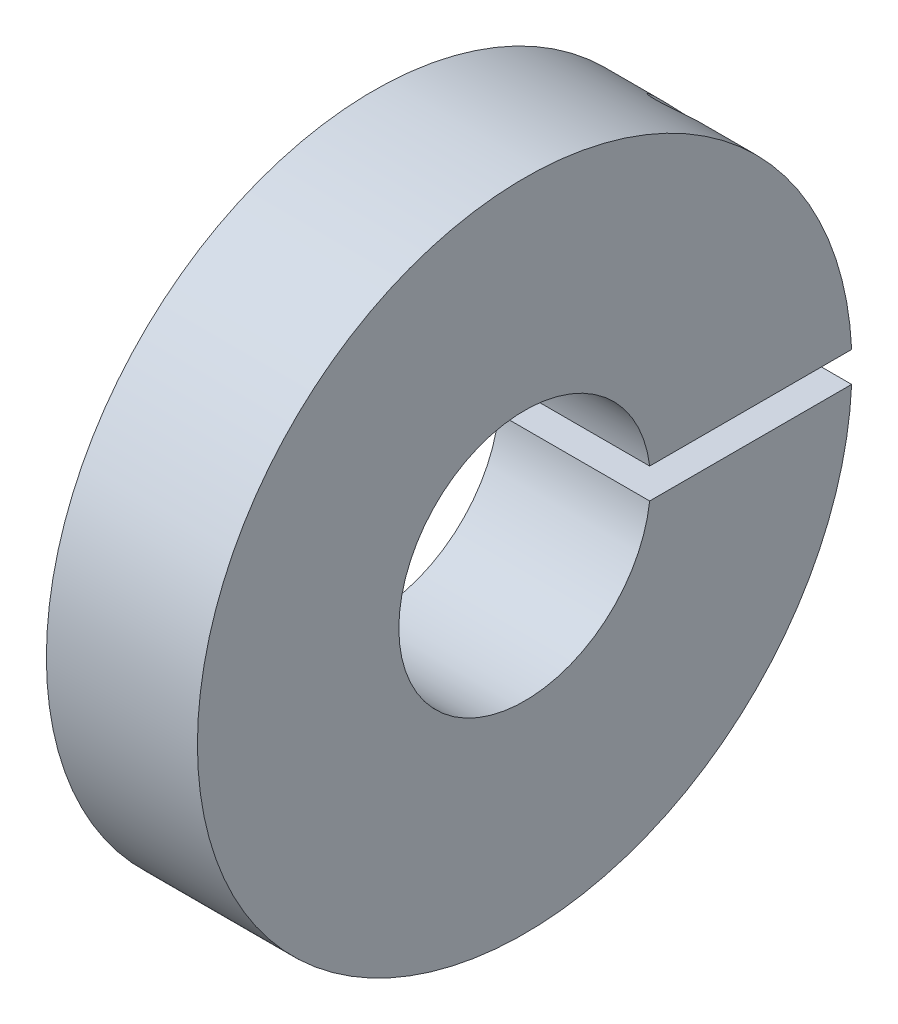
ISO-10303-21;
HEADER;
FILE_DESCRIPTION(('STEP AP214'),'2;1');
FILE_NAME('part.step','',(''),(''),'','','');
FILE_SCHEMA(('AUTOMOTIVE_DESIGN { 1 0 10303 214 1 1 1 1 }'));
ENDSEC;
DATA;
#1=APPLICATION_CONTEXT('core data for automotive mechanical design processes');
#2=APPLICATION_PROTOCOL_DEFINITION('international standard','automotive_design',2000,#1);
#3=PRODUCT_CONTEXT('',#1,'mechanical');
#4=PRODUCT('Part','Part','',(#3));
#5=PRODUCT_RELATED_PRODUCT_CATEGORY('part','',(#4));
#6=PRODUCT_DEFINITION_FORMATION('','',#4);
#7=PRODUCT_DEFINITION_CONTEXT('part definition',#1,'design');
#8=PRODUCT_DEFINITION('design','',#6,#7);
#9=PRODUCT_DEFINITION_SHAPE('','',#8);
#10=(LENGTH_UNIT() NAMED_UNIT(*) SI_UNIT(.MILLI.,.METRE.));
#11=(NAMED_UNIT(*) PLANE_ANGLE_UNIT() SI_UNIT($,.RADIAN.));
#12=(NAMED_UNIT(*) SI_UNIT($,.STERADIAN.) SOLID_ANGLE_UNIT());
#13=UNCERTAINTY_MEASURE_WITH_UNIT(LENGTH_MEASURE(1.E-05),#10,'distance_accuracy_value','');
#14=(GEOMETRIC_REPRESENTATION_CONTEXT(3) GLOBAL_UNCERTAINTY_ASSIGNED_CONTEXT((#13)) GLOBAL_UNIT_ASSIGNED_CONTEXT((#10,
#11,#12)) REPRESENTATION_CONTEXT('',''));
#15=CARTESIAN_POINT('',(0.,0.,0.));
#16=DIRECTION('',(0.,0.,1.));
#17=DIRECTION('',(1.,0.,0.));
#18=AXIS2_PLACEMENT_3D('',#15,#16,#17);
#19=CARTESIAN_POINT('',(1.905,0.,0.));
#20=DIRECTION('',(1.,0.,0.));
#21=DIRECTION('',(0.,0.,-1.));
#22=AXIS2_PLACEMENT_3D('',#19,#20,#21);
#23=PLANE('',#22);
#24=DIRECTION('',(0.,0.,-1.));
#25=VECTOR('',#24,1.);
#26=CARTESIAN_POINT('',(1.905,-0.381,0.));
#27=LINE('',#26,#25);
#28=CARTESIAN_POINT('',(1.905,-0.381,-3.15205710608168));
#29=VERTEX_POINT('',#28);
#30=CARTESIAN_POINT('',(1.905,-0.381,-8.24620300501994));
#31=VERTEX_POINT('',#30);
#32=EDGE_CURVE('E100',#29,#31,#27,.T.);
#33=ORIENTED_EDGE('',*,*,#32,.F.);
#34=CARTESIAN_POINT('',(1.905,0.,0.));
#35=DIRECTION('',(1.,0.,0.));
#36=DIRECTION('',(0.,0.,-1.));
#37=AXIS2_PLACEMENT_3D('',#34,#35,#36);
#38=CIRCLE('',#37,3.175);
#39=CARTESIAN_POINT('',(1.905,0.381,-3.15205710608168));
#40=VERTEX_POINT('',#39);
#41=EDGE_CURVE('E104',#40,#29,#38,.T.);
#42=ORIENTED_EDGE('',*,*,#41,.F.);
#43=DIRECTION('',(0.,0.,-1.));
#44=VECTOR('',#43,1.);
#45=CARTESIAN_POINT('',(1.905,0.381,0.));
#46=LINE('',#45,#44);
#47=CARTESIAN_POINT('',(1.905,0.381,-8.24620300501994));
#48=VERTEX_POINT('',#47);
#49=EDGE_CURVE('E64',#40,#48,#46,.T.);
#50=ORIENTED_EDGE('',*,*,#49,.T.);
#51=CARTESIAN_POINT('',(1.905,0.,0.));
#52=DIRECTION('',(1.,0.,0.));
#53=DIRECTION('',(0.,0.,-1.));
#54=AXIS2_PLACEMENT_3D('',#51,#52,#53);
#55=CIRCLE('',#54,8.255);
#56=EDGE_CURVE('E97',#48,#31,#55,.T.);
#57=ORIENTED_EDGE('',*,*,#56,.T.);
#58=EDGE_LOOP('',(#33,#42,#50,#57));
#59=FACE_BOUND('',#58,.T.);
#60=ADVANCED_FACE('F39',(#59),#23,.T.);
#61=CARTESIAN_POINT('',(-1.905,0.,0.));
#62=DIRECTION('',(1.,0.,0.));
#63=DIRECTION('',(0.,0.,-1.));
#64=AXIS2_PLACEMENT_3D('',#61,#62,#63);
#65=PLANE('',#64);
#66=CARTESIAN_POINT('',(-1.905,0.,0.));
#67=DIRECTION('',(1.,0.,0.));
#68=DIRECTION('',(0.,0.,-1.));
#69=AXIS2_PLACEMENT_3D('',#66,#67,#68);
#70=CIRCLE('',#69,3.175);
#71=CARTESIAN_POINT('',(-1.905,0.381,-3.15205710608168));
#72=VERTEX_POINT('',#71);
#73=CARTESIAN_POINT('',(-1.905,-0.381,-3.15205710608168));
#74=VERTEX_POINT('',#73);
#75=EDGE_CURVE('E110',#72,#74,#70,.T.);
#76=ORIENTED_EDGE('',*,*,#75,.T.);
#77=DIRECTION('',(0.,0.,1.));
#78=VECTOR('',#77,1.);
#79=CARTESIAN_POINT('',(-1.905,-0.381,0.));
#80=LINE('',#79,#78);
#81=CARTESIAN_POINT('',(-1.905,-0.381,-8.24620300501994));
#82=VERTEX_POINT('',#81);
#83=EDGE_CURVE('E56',#82,#74,#80,.T.);
#84=ORIENTED_EDGE('',*,*,#83,.F.);
#85=CARTESIAN_POINT('',(-1.905,0.,0.));
#86=DIRECTION('',(1.,0.,0.));
#87=DIRECTION('',(0.,0.,-1.));
#88=AXIS2_PLACEMENT_3D('',#85,#86,#87);
#89=CIRCLE('',#88,8.255);
#90=CARTESIAN_POINT('',(-1.905,0.381,-8.24620300501994));
#91=VERTEX_POINT('',#90);
#92=EDGE_CURVE('E95',#91,#82,#89,.T.);
#93=ORIENTED_EDGE('',*,*,#92,.F.);
#94=DIRECTION('',(0.,0.,1.));
#95=VECTOR('',#94,1.);
#96=CARTESIAN_POINT('',(-1.905,0.381,0.));
#97=LINE('',#96,#95);
#98=EDGE_CURVE('E80',#91,#72,#97,.T.);
#99=ORIENTED_EDGE('',*,*,#98,.T.);
#100=EDGE_LOOP('',(#76,#84,#93,#99));
#101=FACE_BOUND('',#100,.T.);
#102=ADVANCED_FACE('F102',(#101),#65,.F.);
#103=CARTESIAN_POINT('',(1.905,0.,0.));
#104=DIRECTION('',(-1.,0.,0.));
#105=DIRECTION('',(0.,0.,1.));
#106=AXIS2_PLACEMENT_3D('',#103,#104,#105);
#107=CYLINDRICAL_SURFACE('',#106,8.255);
#108=CARTESIAN_POINT('',(0.,-6.41277712996496,-5.19820300501994));
#109=CARTESIAN_POINT('',(0.0238094108806957,-6.41277477260758,-5.19820618865845));
#110=CARTESIAN_POINT('',(0.0476598656179669,-6.41140969884632,-5.1998913706819));
#111=CARTESIAN_POINT('',(0.0946312717789927,-6.40602129347081,-5.20652793550343));
#112=CARTESIAN_POINT('',(0.117750008565126,-6.40199057540135,-5.21148839397593));
#113=CARTESIAN_POINT('',(0.162445184516025,-6.39152510359019,-5.22431807130577));
#114=CARTESIAN_POINT('',(0.184029092337019,-6.38510309870764,-5.23217186238736));
#115=CARTESIAN_POINT('',(0.225322067793895,-6.37016523802053,-5.25034833356413));
#116=CARTESIAN_POINT('',(0.245031728938935,-6.36165004813804,-5.26067022843282));
#117=CARTESIAN_POINT('',(0.283633395659268,-6.34219482815178,-5.28411171710845));
#118=CARTESIAN_POINT('',(0.302371807517552,-6.33112685936934,-5.29737648948131));
#119=CARTESIAN_POINT('',(0.337289173080558,-6.30734622227367,-5.32566912684686));
#120=CARTESIAN_POINT('',(0.353466391452005,-6.29463244935992,-5.34069817531704));
#121=CARTESIAN_POINT('',(0.390951706779381,-6.26097016060757,-5.38017173475738));
#122=CARTESIAN_POINT('',(0.410594826052407,-6.23915984647251,-5.40547029260479));
#123=CARTESIAN_POINT('',(0.444242741308275,-6.19340391865768,-5.45783759501549));
#124=CARTESIAN_POINT('',(0.458234978841549,-6.1694536918429,-5.48491012865679));
#125=CARTESIAN_POINT('',(0.484198714173878,-6.11300926252779,-5.5478280753555));
#126=CARTESIAN_POINT('',(0.494435484875781,-6.0800368598191,-5.58395985302357));
#127=CARTESIAN_POINT('',(0.506880564197758,-6.01276540304175,-5.6563352251898));
#128=CARTESIAN_POINT('',(0.509082816328068,-5.97846536786627,-5.69257888343645));
#129=CARTESIAN_POINT('',(0.505923386935991,-5.90890458379507,-5.76475658829126));
#130=CARTESIAN_POINT('',(0.500456021606107,-5.87363710798433,-5.80067930798601));
#131=CARTESIAN_POINT('',(0.481933278283008,-5.80345566526111,-5.87089318108108));
#132=CARTESIAN_POINT('',(0.468879748045043,-5.76854161437137,-5.9051847295847));
#133=CARTESIAN_POINT('',(0.437952030698649,-5.7061561350811,-5.96542937582451));
#134=CARTESIAN_POINT('',(0.421329186163694,-5.67845556252395,-5.99178839568317));
#135=CARTESIAN_POINT('',(0.382419977884698,-5.6248878955355,-6.04210235945122));
#136=CARTESIAN_POINT('',(0.360143191771124,-5.59901779417393,-6.06606127429067));
#137=CARTESIAN_POINT('',(0.317510037041719,-5.55822257942401,-6.10341662125829));
#138=CARTESIAN_POINT('',(0.298799977393816,-5.54243497667265,-6.11774746432326));
#139=CARTESIAN_POINT('',(0.258371212897804,-5.51303266466337,-6.14425625607038));
#140=CARTESIAN_POINT('',(0.236657171568209,-5.49941465640727,-6.15643747647866));
#141=CARTESIAN_POINT('',(0.195460376011602,-5.47797538707187,-6.17551370649716));
#142=CARTESIAN_POINT('',(0.176566953939167,-5.46953893629203,-6.18298163112173));
#143=CARTESIAN_POINT('',(0.137189359797008,-5.45505476107813,-6.19576436946514));
#144=CARTESIAN_POINT('',(0.116706474432953,-5.44900512811143,-6.20108090355334));
#145=CARTESIAN_POINT('',(0.0744076998507486,-5.43976490560247,-6.20918852046021));
#146=CARTESIAN_POINT('',(0.0525817200129441,-5.43659978082825,-6.21195711181315));
#147=CARTESIAN_POINT('',(0.00853106625816597,-5.43356803701769,-6.21460925482677));
#148=CARTESIAN_POINT('',(-0.0136933233432901,-5.43369915254496,-6.21449478795243));
#149=CARTESIAN_POINT('',(-0.0547102047096544,-5.43699629817942,-6.2116100281818));
#150=CARTESIAN_POINT('',(-0.0735638001996974,-5.43975364916085,-6.20919736179483));
#151=CARTESIAN_POINT('',(-0.110436813359387,-5.44749333994184,-6.20240821517726));
#152=CARTESIAN_POINT('',(-0.128455866775525,-5.45247664138934,-6.19803088617553));
#153=CARTESIAN_POINT('',(-0.168702210065011,-5.46616717486943,-6.18596372824295));
#154=CARTESIAN_POINT('',(-0.190517503076889,-5.475548525036,-6.17766901004167));
#155=CARTESIAN_POINT('',(-0.23183282958652,-5.49677342371378,-6.15879122197096));
#156=CARTESIAN_POINT('',(-0.25132836076092,-5.50862164139991,-6.14820381105161));
#157=CARTESIAN_POINT('',(-0.295566893890295,-5.53941457501682,-6.12049798211948));
#158=CARTESIAN_POINT('',(-0.319122403786914,-5.55926187863099,-6.10249417940723));
#159=CARTESIAN_POINT('',(-0.361751140866674,-5.60121413388451,-6.06401210655131));
#160=CARTESIAN_POINT('',(-0.380815516462688,-5.62332342274678,-6.04352906832081));
#161=CARTESIAN_POINT('',(-0.421609777708329,-5.67810451344867,-5.99216694345481));
#162=CARTESIAN_POINT('',(-0.441335187275912,-5.71145226762811,-5.96041645333789));
#163=CARTESIAN_POINT('',(-0.473204057886149,-5.77939144960125,-5.89456607261734));
#164=CARTESIAN_POINT('',(-0.485340034656605,-5.81398406958175,-5.86046389958516));
#165=CARTESIAN_POINT('',(-0.502369362665487,-5.88413774159169,-5.79003167010219));
#166=CARTESIAN_POINT('',(-0.507111765563054,-5.91970425762911,-5.75367055900618));
#167=CARTESIAN_POINT('',(-0.508661362954525,-5.99023208067415,-5.68020526783268));
#168=CARTESIAN_POINT('',(-0.505473572334097,-6.02519375608985,-5.64310157207026));
#169=CARTESIAN_POINT('',(-0.491735657276644,-6.08845789874821,-5.57472348518094));
#170=CARTESIAN_POINT('',(-0.482362208970352,-6.11697233279601,-5.54340991458929));
#171=CARTESIAN_POINT('',(-0.456990569872816,-6.17218819778715,-5.48186257526303));
#172=CARTESIAN_POINT('',(-0.441000550755429,-6.1988918179599,-5.45162752437993));
#173=CARTESIAN_POINT('',(-0.406566529810547,-6.24346970505695,-5.40046079692158));
#174=CARTESIAN_POINT('',(-0.389621195706964,-6.26192931729167,-5.37903205859816));
#175=CARTESIAN_POINT('',(-0.351438040163026,-6.29666406754923,-5.33832919333991));
#176=CARTESIAN_POINT('',(-0.33020659522332,-6.31294239153983,-5.31905193101777));
#177=CARTESIAN_POINT('',(-0.288012415326993,-6.33973658526076,-5.28707051774822));
#178=CARTESIAN_POINT('',(-0.267790221650293,-6.35075815478339,-5.27381598565603));
#179=CARTESIAN_POINT('',(-0.224763346699144,-6.37048571181246,-5.24996919308794));
#180=CARTESIAN_POINT('',(-0.201958049318107,-6.37919114522269,-5.23937756970101));
#181=CARTESIAN_POINT('',(-0.154023634644996,-6.39388732445461,-5.22143341421295));
#182=CARTESIAN_POINT('',(-0.12887587146202,-6.39985356307443,-5.21411013920644));
#183=CARTESIAN_POINT('',(-0.0772620529185802,-6.40854254146694,-5.20342744252373));
#184=CARTESIAN_POINT('',(-0.0508010400784929,-6.41127681806047,-5.20005392220344));
#185=CARTESIAN_POINT('',(-0.0161614314539486,-6.41262167185239,-5.19839470067466));
#186=CARTESIAN_POINT('',(-0.0080830809643006,-6.4127779302666,-5.19820192420329));
#187=CARTESIAN_POINT('',(0.,-6.41277712996496,-5.19820300501994));
#188=B_SPLINE_CURVE_WITH_KNOTS('',3,(#108,#109,#110,#111,#112,#113,#114,#115,#116,#117,#118,
#119,#120,#121,#122,#123,#124,#125,#126,#127,#128,#129,#130,#131,#132,#133,#134,#135,#136,#137,
#138,#139,#140,#141,#142,#143,#144,#145,#146,#147,#148,#149,#150,#151,#152,#153,#154,#155,#156,
#157,#158,#159,#160,#161,#162,#163,#164,#165,#166,#167,#168,#169,#170,#171,#172,#173,#174,#175,
#176,#177,#178,#179,#180,#181,#182,#183,#184,#185,#186,#187),.UNSPECIFIED.,.T.,.F.,(4,2,2,2,2,2,
2,2,2,2,2,2,2,2,2,2,2,2,2,2,2,2,2,2,2,2,2,2,2,2,2,2,2,2,2,2,2,2,2,4),(0.,0.071404038898495,
0.14300677089106,0.214233103404454,0.28543680536152,0.361620395375126,0.437855384592835,
0.553462082115485,0.66932430711251,0.818464895055505,0.967717883265166,1.11904782966007,
1.27034093219721,1.39502957921169,1.51950840044332,1.6043594435675,1.68908020815505,
1.75482785356004,1.82052281916604,1.88679228253673,1.95301620154982,2.010373745919,
2.06775609371135,2.14280199325937,2.21799124903868,2.32443607032244,2.43108896085717,
2.5805752849908,2.73020879263608,2.88285900156244,3.03541270228635,3.16507233087247,
3.29457230141782,3.39313717261527,3.49155647416319,3.57096158787163,3.65038568085788,
3.73050714942394,3.81034174406595,3.83458277340038),.UNSPECIFIED.);
#189=CARTESIAN_POINT('',(0.,-6.41277712996496,-5.19820300501994));
#190=VERTEX_POINT('',#189);
#191=EDGE_CURVE('E89',#190,#190,#188,.T.);
#192=ORIENTED_EDGE('',*,*,#191,.T.);
#193=EDGE_LOOP('',(#192));
#194=FACE_BOUND('',#193,.T.);
#195=CARTESIAN_POINT('',(0.,6.41277712996496,-5.19820300501994));
#196=CARTESIAN_POINT('',(-0.0238094108806955,6.41277477260758,-5.19820618865845));
#197=CARTESIAN_POINT('',(-0.0476598656179665,6.41140969884632,-5.1998913706819));
#198=CARTESIAN_POINT('',(-0.0946312717789923,6.40602129347081,-5.20652793550343));
#199=CARTESIAN_POINT('',(-0.117750008565126,6.40199057540135,-5.21148839397593));
#200=CARTESIAN_POINT('',(-0.162445184516025,6.39152510359019,-5.22431807130577));
#201=CARTESIAN_POINT('',(-0.184029092337019,6.38510309870764,-5.23217186238736));
#202=CARTESIAN_POINT('',(-0.225322067793895,6.37016523802053,-5.25034833356413));
#203=CARTESIAN_POINT('',(-0.245031728938935,6.36165004813804,-5.26067022843282));
#204=CARTESIAN_POINT('',(-0.283633395659268,6.34219482815178,-5.28411171710845));
#205=CARTESIAN_POINT('',(-0.302371807517552,6.33112685936934,-5.29737648948131));
#206=CARTESIAN_POINT('',(-0.337289173080557,6.30734622227367,-5.32566912684686));
#207=CARTESIAN_POINT('',(-0.353466391452005,6.29463244935992,-5.34069817531704));
#208=CARTESIAN_POINT('',(-0.390951706779381,6.26097016060757,-5.38017173475738));
#209=CARTESIAN_POINT('',(-0.410594826052408,6.23915984647251,-5.40547029260479));
#210=CARTESIAN_POINT('',(-0.444242741308276,6.19340391865768,-5.45783759501549));
#211=CARTESIAN_POINT('',(-0.458234978841549,6.1694536918429,-5.48491012865679));
#212=CARTESIAN_POINT('',(-0.484198714173878,6.11300926252779,-5.5478280753555));
#213=CARTESIAN_POINT('',(-0.494435484875781,6.0800368598191,-5.58395985302357));
#214=CARTESIAN_POINT('',(-0.506880564197758,6.01276540304175,-5.6563352251898));
#215=CARTESIAN_POINT('',(-0.509082816328068,5.97846536786627,-5.69257888343646));
#216=CARTESIAN_POINT('',(-0.505923386935991,5.90890458379507,-5.76475658829126));
#217=CARTESIAN_POINT('',(-0.500456021606107,5.87363710798433,-5.80067930798601));
#218=CARTESIAN_POINT('',(-0.481933278283008,5.80345566526111,-5.87089318108108));
#219=CARTESIAN_POINT('',(-0.468879748045044,5.76854161437137,-5.9051847295847));
#220=CARTESIAN_POINT('',(-0.437952030698649,5.7061561350811,-5.96542937582451));
#221=CARTESIAN_POINT('',(-0.421329186163693,5.67845556252395,-5.99178839568317));
#222=CARTESIAN_POINT('',(-0.382419977884698,5.6248878955355,-6.04210235945122));
#223=CARTESIAN_POINT('',(-0.360143191771125,5.59901779417393,-6.06606127429067));
#224=CARTESIAN_POINT('',(-0.31751003704172,5.55822257942402,-6.10341662125828));
#225=CARTESIAN_POINT('',(-0.298799977393816,5.54243497667265,-6.11774746432325));
#226=CARTESIAN_POINT('',(-0.258371212897804,5.51303266466338,-6.14425625607038));
#227=CARTESIAN_POINT('',(-0.23665717156821,5.49941465640727,-6.15643747647866));
#228=CARTESIAN_POINT('',(-0.195460376011603,5.47797538707187,-6.17551370649716));
#229=CARTESIAN_POINT('',(-0.176566953939167,5.46953893629203,-6.18298163112173));
#230=CARTESIAN_POINT('',(-0.137189359797008,5.45505476107813,-6.19576436946514));
#231=CARTESIAN_POINT('',(-0.116706474432953,5.44900512811143,-6.20108090355334));
#232=CARTESIAN_POINT('',(-0.0744076998507481,5.43976490560247,-6.20918852046021));
#233=CARTESIAN_POINT('',(-0.0525817200129434,5.43659978082825,-6.21195711181315));
#234=CARTESIAN_POINT('',(-0.0085310662581648,5.43356803701769,-6.21460925482677));
#235=CARTESIAN_POINT('',(0.0136933233432916,5.43369915254496,-6.21449478795243));
#236=CARTESIAN_POINT('',(0.0547102047096566,5.43699629817942,-6.2116100281818));
#237=CARTESIAN_POINT('',(0.0735638001996998,5.43975364916085,-6.20919736179483));
#238=CARTESIAN_POINT('',(0.110436813359389,5.44749333994184,-6.20240821517726));
#239=CARTESIAN_POINT('',(0.128455866775527,5.45247664138934,-6.19803088617553));
#240=CARTESIAN_POINT('',(0.168702210065013,5.46616717486943,-6.18596372824295));
#241=CARTESIAN_POINT('',(0.190517503076891,5.475548525036,-6.17766901004167));
#242=CARTESIAN_POINT('',(0.231832829586522,5.49677342371378,-6.15879122197096));
#243=CARTESIAN_POINT('',(0.251328360760921,5.50862164139991,-6.14820381105161));
#244=CARTESIAN_POINT('',(0.295566893890296,5.53941457501682,-6.12049798211948));
#245=CARTESIAN_POINT('',(0.319122403786915,5.55926187863099,-6.10249417940723));
#246=CARTESIAN_POINT('',(0.361751140866676,5.60121413388452,-6.06401210655131));
#247=CARTESIAN_POINT('',(0.38081551646269,5.62332342274678,-6.04352906832081));
#248=CARTESIAN_POINT('',(0.421609777708331,5.67810451344867,-5.99216694345481));
#249=CARTESIAN_POINT('',(0.441335187275913,5.71145226762811,-5.96041645333789));
#250=CARTESIAN_POINT('',(0.47320405788615,5.77939144960125,-5.89456607261734));
#251=CARTESIAN_POINT('',(0.485340034656606,5.81398406958176,-5.86046389958516));
#252=CARTESIAN_POINT('',(0.502369362665488,5.88413774159169,-5.79003167010219));
#253=CARTESIAN_POINT('',(0.507111765563055,5.91970425762912,-5.75367055900618));
#254=CARTESIAN_POINT('',(0.508661362954525,5.99023208067415,-5.68020526783268));
#255=CARTESIAN_POINT('',(0.505473572334097,6.02519375608985,-5.64310157207026));
#256=CARTESIAN_POINT('',(0.491735657276643,6.08845789874821,-5.57472348518093));
#257=CARTESIAN_POINT('',(0.482362208970351,6.11697233279601,-5.54340991458928));
#258=CARTESIAN_POINT('',(0.456990569872815,6.17218819778715,-5.48186257526302));
#259=CARTESIAN_POINT('',(0.441000550755427,6.1988918179599,-5.45162752437993));
#260=CARTESIAN_POINT('',(0.406566529810545,6.24346970505695,-5.40046079692158));
#261=CARTESIAN_POINT('',(0.389621195706962,6.26192931729167,-5.37903205859816));
#262=CARTESIAN_POINT('',(0.351438040163024,6.29666406754923,-5.33832919333991));
#263=CARTESIAN_POINT('',(0.330206595223318,6.31294239153983,-5.31905193101777));
#264=CARTESIAN_POINT('',(0.288012415326991,6.33973658526077,-5.28707051774822));
#265=CARTESIAN_POINT('',(0.26779022165029,6.35075815478339,-5.27381598565602));
#266=CARTESIAN_POINT('',(0.224763346699141,6.37048571181246,-5.24996919308794));
#267=CARTESIAN_POINT('',(0.201958049318105,6.37919114522269,-5.23937756970101));
#268=CARTESIAN_POINT('',(0.154023634644994,6.39388732445461,-5.22143341421295));
#269=CARTESIAN_POINT('',(0.128875871462019,6.39985356307443,-5.21411013920644));
#270=CARTESIAN_POINT('',(0.0772620529185795,6.40854254146693,-5.20342744252373));
#271=CARTESIAN_POINT('',(0.0508010400784922,6.41127681806046,-5.20005392220344));
#272=CARTESIAN_POINT('',(0.0161614314539481,6.41262167185239,-5.19839470067466));
#273=CARTESIAN_POINT('',(0.0080830809643004,6.4127779302666,-5.19820192420329));
#274=CARTESIAN_POINT('',(0.,6.41277712996496,-5.19820300501994));
#275=B_SPLINE_CURVE_WITH_KNOTS('',3,(#195,#196,#197,#198,#199,#200,#201,#202,#203,#204,#205,
#206,#207,#208,#209,#210,#211,#212,#213,#214,#215,#216,#217,#218,#219,#220,#221,#222,#223,#224,
#225,#226,#227,#228,#229,#230,#231,#232,#233,#234,#235,#236,#237,#238,#239,#240,#241,#242,#243,
#244,#245,#246,#247,#248,#249,#250,#251,#252,#253,#254,#255,#256,#257,#258,#259,#260,#261,#262,
#263,#264,#265,#266,#267,#268,#269,#270,#271,#272,#273,#274),.UNSPECIFIED.,.T.,.F.,(4,2,2,2,2,2,
2,2,2,2,2,2,2,2,2,2,2,2,2,2,2,2,2,2,2,2,2,2,2,2,2,2,2,2,2,2,2,2,2,4),(0.,0.0714040388984947,
0.14300677089106,0.214233103404455,0.28543680536152,0.361620395375126,0.437855384592835,
0.553462082115486,0.66932430711251,0.818464895055506,0.967717883265168,1.11904782966007,
1.27034093219721,1.39502957921169,1.51950840044332,1.6043594435675,1.68908020815504,
1.75482785356004,1.82052281916604,1.88679228253673,1.95301620154982,2.010373745919,
2.06775609371136,2.14280199325937,2.21799124903868,2.32443607032245,2.43108896085717,
2.58057528499081,2.73020879263609,2.88285900156244,3.03541270228635,3.16507233087247,
3.29457230141783,3.39313717261528,3.4915564741632,3.57096158787164,3.65038568085789,
3.73050714942394,3.81034174406595,3.83458277340038),.UNSPECIFIED.);
#276=CARTESIAN_POINT('',(0.,6.41277712996496,-5.19820300501994));
#277=VERTEX_POINT('',#276);
#278=EDGE_CURVE('E163',#277,#277,#275,.T.);
#279=ORIENTED_EDGE('',*,*,#278,.T.);
#280=EDGE_LOOP('',(#279));
#281=FACE_BOUND('',#280,.T.);
#282=ORIENTED_EDGE('',*,*,#92,.T.);
#283=DIRECTION('',(-1.,0.,0.));
#284=VECTOR('',#283,1.);
#285=CARTESIAN_POINT('',(1.905,-0.381,-8.24620300501994));
#286=LINE('',#285,#284);
#287=EDGE_CURVE('E99',#82,#31,#286,.F.);
#288=ORIENTED_EDGE('',*,*,#287,.T.);
#289=ORIENTED_EDGE('',*,*,#56,.F.);
#290=DIRECTION('',(-1.,0.,0.));
#291=VECTOR('',#290,1.);
#292=CARTESIAN_POINT('',(1.905,0.381,-8.24620300501994));
#293=LINE('',#292,#291);
#294=EDGE_CURVE('E83',#91,#48,#293,.F.);
#295=ORIENTED_EDGE('',*,*,#294,.F.);
#296=EDGE_LOOP('',(#282,#288,#289,#295));
#297=FACE_BOUND('',#296,.T.);
#298=ADVANCED_FACE('F41',(#194,#281,#297),#107,.T.);
#299=CARTESIAN_POINT('',(1.905,0.,0.));
#300=DIRECTION('',(-1.,0.,0.));
#301=DIRECTION('',(0.,0.,1.));
#302=AXIS2_PLACEMENT_3D('',#299,#300,#301);
#303=CYLINDRICAL_SURFACE('',#302,3.175);
#304=DIRECTION('',(-1.,0.,0.));
#305=VECTOR('',#304,1.);
#306=CARTESIAN_POINT('',(1.905,-0.381,-3.15205710608168));
#307=LINE('',#306,#305);
#308=EDGE_CURVE('E11',#74,#29,#307,.F.);
#309=ORIENTED_EDGE('',*,*,#308,.F.);
#310=ORIENTED_EDGE('',*,*,#75,.F.);
#311=DIRECTION('',(-1.,0.,0.));
#312=VECTOR('',#311,1.);
#313=CARTESIAN_POINT('',(1.905,0.381,-3.15205710608168));
#314=LINE('',#313,#312);
#315=EDGE_CURVE('E50',#72,#40,#314,.F.);
#316=ORIENTED_EDGE('',*,*,#315,.T.);
#317=ORIENTED_EDGE('',*,*,#41,.T.);
#318=EDGE_LOOP('',(#309,#310,#316,#317));
#319=FACE_BOUND('',#318,.T.);
#320=ADVANCED_FACE('F117',(#319),#303,.F.);
#321=CARTESIAN_POINT('',(0.,0.381,0.));
#322=DIRECTION('',(0.,-1.,0.));
#323=DIRECTION('',(0.,0.,-1.));
#324=AXIS2_PLACEMENT_3D('',#321,#322,#323);
#325=PLANE('',#324);
#326=CARTESIAN_POINT('',(0.,0.380999999999999,-5.70620300501994));
#327=DIRECTION('',(0.,-1.,0.));
#328=DIRECTION('',(0.,0.,-1.));
#329=AXIS2_PLACEMENT_3D('',#326,#327,#328);
#330=CIRCLE('',#329,0.508);
#331=CARTESIAN_POINT('',(0.,0.380999999999999,-6.21420300501994));
#332=VERTEX_POINT('',#331);
#333=EDGE_CURVE('E166',#332,#332,#330,.T.);
#334=ORIENTED_EDGE('',*,*,#333,.F.);
#335=EDGE_LOOP('',(#334));
#336=FACE_BOUND('',#335,.T.);
#337=ORIENTED_EDGE('',*,*,#294,.T.);
#338=ORIENTED_EDGE('',*,*,#49,.F.);
#339=ORIENTED_EDGE('',*,*,#315,.F.);
#340=ORIENTED_EDGE('',*,*,#98,.F.);
#341=EDGE_LOOP('',(#337,#338,#339,#340));
#342=FACE_BOUND('',#341,.T.);
#343=ADVANCED_FACE('F82',(#336,#342),#325,.T.);
#344=CARTESIAN_POINT('',(0.,-0.381,0.));
#345=DIRECTION('',(0.,-1.,0.));
#346=DIRECTION('',(0.,0.,-1.));
#347=AXIS2_PLACEMENT_3D('',#344,#345,#346);
#348=PLANE('',#347);
#349=CARTESIAN_POINT('',(0.,-0.380999999999999,-5.70620300501994));
#350=DIRECTION('',(0.,-1.,0.));
#351=DIRECTION('',(0.,0.,-1.));
#352=AXIS2_PLACEMENT_3D('',#349,#350,#351);
#353=CIRCLE('',#352,0.508);
#354=CARTESIAN_POINT('',(0.,-0.380999999999999,-6.21420300501994));
#355=VERTEX_POINT('',#354);
#356=EDGE_CURVE('E44',#355,#355,#353,.T.);
#357=ORIENTED_EDGE('',*,*,#356,.T.);
#358=EDGE_LOOP('',(#357));
#359=FACE_BOUND('',#358,.T.);
#360=ORIENTED_EDGE('',*,*,#83,.T.);
#361=ORIENTED_EDGE('',*,*,#308,.T.);
#362=ORIENTED_EDGE('',*,*,#32,.T.);
#363=ORIENTED_EDGE('',*,*,#287,.F.);
#364=EDGE_LOOP('',(#360,#361,#362,#363));
#365=FACE_BOUND('',#364,.T.);
#366=ADVANCED_FACE('F130',(#359,#365),#348,.F.);
#367=CARTESIAN_POINT('',(0.,-8.255,-5.70620300501994));
#368=DIRECTION('',(0.,1.,0.));
#369=DIRECTION('',(0.,0.,1.));
#370=AXIS2_PLACEMENT_3D('',#367,#368,#369);
#371=CYLINDRICAL_SURFACE('',#370,0.508);
#372=ORIENTED_EDGE('',*,*,#356,.F.);
#373=EDGE_LOOP('',(#372));
#374=FACE_BOUND('',#373,.T.);
#375=ORIENTED_EDGE('',*,*,#191,.F.);
#376=EDGE_LOOP('',(#375));
#377=FACE_BOUND('',#376,.T.);
#378=ADVANCED_FACE('F132',(#374,#377),#371,.F.);
#379=ORIENTED_EDGE('',*,*,#333,.T.);
#380=EDGE_LOOP('',(#379));
#381=FACE_BOUND('',#380,.T.);
#382=ORIENTED_EDGE('',*,*,#278,.F.);
#383=EDGE_LOOP('',(#382));
#384=FACE_BOUND('',#383,.T.);
#385=ADVANCED_FACE('F139',(#381,#384),#371,.F.);
#386=CLOSED_SHELL('',(#60,#102,#298,#320,#343,#366,#378,#385));
#387=MANIFOLD_SOLID_BREP('B2',#386);
#388=ADVANCED_BREP_SHAPE_REPRESENTATION('',(#18,#387),#14);
#389=SHAPE_DEFINITION_REPRESENTATION(#9,#388);
ENDSEC;
END-ISO-10303-21;
